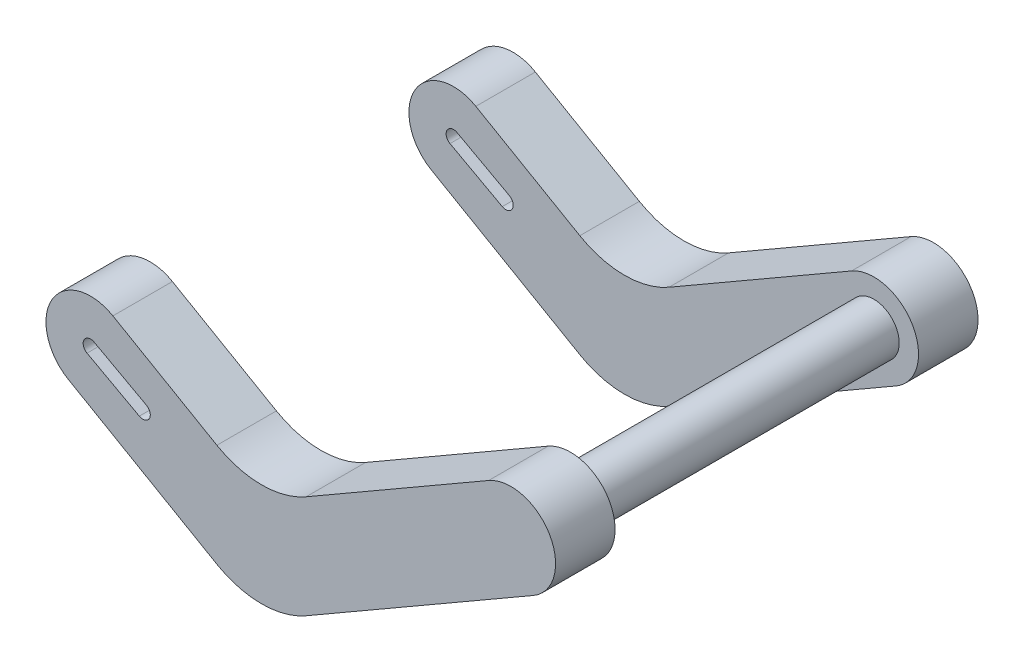
ISO-10303-21;
HEADER;
FILE_DESCRIPTION(('STEP AP214'),'2;1');
FILE_NAME('part.step','',(''),(''),'','','');
FILE_SCHEMA(('AUTOMOTIVE_DESIGN { 1 0 10303 214 1 1 1 1 }'));
ENDSEC;
DATA;
#1=APPLICATION_CONTEXT('core data for automotive mechanical design processes');
#2=APPLICATION_PROTOCOL_DEFINITION('international standard','automotive_design',2000,#1);
#3=PRODUCT_CONTEXT('',#1,'mechanical');
#4=PRODUCT('Part','Part','',(#3));
#5=PRODUCT_RELATED_PRODUCT_CATEGORY('part','',(#4));
#6=PRODUCT_DEFINITION_FORMATION('','',#4);
#7=PRODUCT_DEFINITION_CONTEXT('part definition',#1,'design');
#8=PRODUCT_DEFINITION('design','',#6,#7);
#9=PRODUCT_DEFINITION_SHAPE('','',#8);
#10=(LENGTH_UNIT() NAMED_UNIT(*) SI_UNIT(.MILLI.,.METRE.));
#11=(NAMED_UNIT(*) PLANE_ANGLE_UNIT() SI_UNIT($,.RADIAN.));
#12=(NAMED_UNIT(*) SI_UNIT($,.STERADIAN.) SOLID_ANGLE_UNIT());
#13=UNCERTAINTY_MEASURE_WITH_UNIT(LENGTH_MEASURE(1.E-05),#10,'distance_accuracy_value','');
#14=(GEOMETRIC_REPRESENTATION_CONTEXT(3) GLOBAL_UNCERTAINTY_ASSIGNED_CONTEXT((#13)) GLOBAL_UNIT_ASSIGNED_CONTEXT((#10,
#11,#12)) REPRESENTATION_CONTEXT('',''));
#15=CARTESIAN_POINT('',(0.,0.,0.));
#16=DIRECTION('',(0.,0.,1.));
#17=DIRECTION('',(1.,0.,0.));
#18=AXIS2_PLACEMENT_3D('',#15,#16,#17);
#19=CARTESIAN_POINT('',(-7.76,4.22163913732359,2.));
#20=DIRECTION('',(0.,0.,1.));
#21=DIRECTION('',(1.,0.,0.));
#22=AXIS2_PLACEMENT_3D('',#19,#20,#21);
#23=PLANE('',#22);
#24=CARTESIAN_POINT('',(6.37,5.74546309417289,2.));
#25=DIRECTION('',(0.,0.,1.));
#26=DIRECTION('',(1.,0.,0.));
#27=AXIS2_PLACEMENT_3D('',#24,#25,#26);
#28=CIRCLE('',#27,0.85);
#29=CARTESIAN_POINT('',(7.22,5.74546309417289,2.));
#30=VERTEX_POINT('',#29);
#31=EDGE_CURVE('E289',#30,#30,#28,.T.);
#32=ORIENTED_EDGE('',*,*,#31,.F.);
#33=EDGE_LOOP('',(#32));
#34=FACE_BOUND('',#33,.T.);
#35=CARTESIAN_POINT('',(-7.76,4.22163913732359,2.));
#36=DIRECTION('',(0.,0.,1.));
#37=DIRECTION('',(1.,0.,0.));
#38=AXIS2_PLACEMENT_3D('',#35,#36,#37);
#39=CIRCLE('',#38,1.5);
#40=CARTESIAN_POINT('',(-7.01,5.52067724300025,2.));
#41=VERTEX_POINT('',#40);
#42=CARTESIAN_POINT('',(-8.51,2.92260103164694,2.));
#43=VERTEX_POINT('',#42);
#44=EDGE_CURVE('E327',#41,#43,#39,.T.);
#45=ORIENTED_EDGE('',*,*,#44,.T.);
#46=DIRECTION('',(0.866025403784438,-0.500000000000001,0.));
#47=VECTOR('',#46,1.);
#48=CARTESIAN_POINT('',(-8.51,2.92260103164694,2.));
#49=LINE('',#48,#47);
#50=CARTESIAN_POINT('',(-3.51467025752682,0.0385460601390894,2.));
#51=VERTEX_POINT('',#50);
#52=EDGE_CURVE('E330',#43,#51,#49,.T.);
#53=ORIENTED_EDGE('',*,*,#52,.T.);
#54=CARTESIAN_POINT('',(-2.01467025752681,2.6366222714924,2.));
#55=DIRECTION('',(0.,0.,1.));
#56=DIRECTION('',(1.,0.,0.));
#57=AXIS2_PLACEMENT_3D('',#54,#55,#56);
#58=CIRCLE('',#57,3.);
#59=CARTESIAN_POINT('',(-0.514670257526808,0.038546060139089,2.));
#60=VERTEX_POINT('',#59);
#61=EDGE_CURVE('E333',#51,#60,#58,.T.);
#62=ORIENTED_EDGE('',*,*,#61,.T.);
#63=DIRECTION('',(0.866025403784437,0.500000000000002,0.));
#64=VECTOR('',#63,1.);
#65=CARTESIAN_POINT('',(-0.514670257526808,0.038546060139089,2.));
#66=LINE('',#65,#64);
#67=CARTESIAN_POINT('',(7.12000000000001,4.44642498849624,2.));
#68=VERTEX_POINT('',#67);
#69=EDGE_CURVE('E335',#60,#68,#66,.T.);
#70=ORIENTED_EDGE('',*,*,#69,.T.);
#71=CARTESIAN_POINT('',(6.37,5.74546309417289,2.));
#72=DIRECTION('',(0.,0.,1.));
#73=DIRECTION('',(-1.,0.,0.));
#74=AXIS2_PLACEMENT_3D('',#71,#72,#73);
#75=CIRCLE('',#74,1.5);
#76=CARTESIAN_POINT('',(5.62,7.04450119984956,2.));
#77=VERTEX_POINT('',#76);
#78=EDGE_CURVE('E337',#68,#77,#75,.T.);
#79=ORIENTED_EDGE('',*,*,#78,.T.);
#80=DIRECTION('',(-0.866025403784437,-0.500000000000002,0.));
#81=VECTOR('',#80,1.);
#82=CARTESIAN_POINT('',(-2.01467025752681,2.63662227149241,2.));
#83=LINE('',#82,#81);
#84=CARTESIAN_POINT('',(-0.514670257526805,3.50264767527685,2.));
#85=VERTEX_POINT('',#84);
#86=EDGE_CURVE('E339',#77,#85,#83,.T.);
#87=ORIENTED_EDGE('',*,*,#86,.T.);
#88=CARTESIAN_POINT('',(-2.01467025752681,6.10072388663016,2.));
#89=DIRECTION('',(0.,0.,1.));
#90=DIRECTION('',(1.,0.,0.));
#91=AXIS2_PLACEMENT_3D('',#88,#89,#90);
#92=CIRCLE('',#91,3.);
#93=CARTESIAN_POINT('',(-3.51467025752682,3.50264767527685,2.));
#94=VERTEX_POINT('',#93);
#95=EDGE_CURVE('E11',#85,#94,#92,.F.);
#96=ORIENTED_EDGE('',*,*,#95,.T.);
#97=DIRECTION('',(-0.866025403784438,0.500000000000001,0.));
#98=VECTOR('',#97,1.);
#99=CARTESIAN_POINT('',(-7.01,5.52067724300025,2.));
#100=LINE('',#99,#98);
#101=EDGE_CURVE('E341',#94,#41,#100,.T.);
#102=ORIENTED_EDGE('',*,*,#101,.T.);
#103=EDGE_LOOP('',(#45,#53,#62,#70,#79,#87,#96,#102));
#104=FACE_BOUND('',#103,.T.);
#105=DIRECTION('',(0.8784226883503,-0.477884484568636,0.));
#106=VECTOR('',#105,1.);
#107=CARTESIAN_POINT('',(-7.87947112114216,4.00203346523601,2.));
#108=LINE('',#107,#106);
#109=CARTESIAN_POINT('',(-7.87947112114216,4.00203346523601,2.));
#110=VERTEX_POINT('',#109);
#111=CARTESIAN_POINT('',(-6.12262574444156,3.04626449609873,2.));
#112=VERTEX_POINT('',#111);
#113=EDGE_CURVE('E298',#110,#112,#108,.T.);
#114=ORIENTED_EDGE('',*,*,#113,.F.);
#115=CARTESIAN_POINT('',(-7.76,4.22163913732359,2.));
#116=DIRECTION('',(0.,0.,1.));
#117=DIRECTION('',(1.,0.,0.));
#118=AXIS2_PLACEMENT_3D('',#115,#116,#117);
#119=CIRCLE('',#118,0.250000000000001);
#120=CARTESIAN_POINT('',(-7.64052887885784,4.44124480941116,2.));
#121=VERTEX_POINT('',#120);
#122=EDGE_CURVE('E296',#121,#110,#119,.T.);
#123=ORIENTED_EDGE('',*,*,#122,.F.);
#124=DIRECTION('',(-0.8784226883503,0.477884484568638,0.));
#125=VECTOR('',#124,1.);
#126=CARTESIAN_POINT('',(-7.64052887885784,4.44124480941116,2.));
#127=LINE('',#126,#125);
#128=CARTESIAN_POINT('',(-5.88368350215724,3.48547584027388,2.));
#129=VERTEX_POINT('',#128);
#130=EDGE_CURVE('E304',#129,#121,#127,.T.);
#131=ORIENTED_EDGE('',*,*,#130,.F.);
#132=CARTESIAN_POINT('',(-6.0031546232994,3.26587016818631,2.));
#133=DIRECTION('',(0.,0.,1.));
#134=DIRECTION('',(1.,0.,0.));
#135=AXIS2_PLACEMENT_3D('',#132,#133,#134);
#136=CIRCLE('',#135,0.25);
#137=EDGE_CURVE('E301',#112,#129,#136,.T.);
#138=ORIENTED_EDGE('',*,*,#137,.F.);
#139=EDGE_LOOP('',(#114,#123,#131,#138));
#140=FACE_BOUND('',#139,.T.);
#141=ADVANCED_FACE('F33',(#34,#104,#140),#23,.T.);
#142=CARTESIAN_POINT('',(-7.76,4.22163913732359,0.));
#143=DIRECTION('',(0.,0.,1.));
#144=DIRECTION('',(1.,0.,0.));
#145=AXIS2_PLACEMENT_3D('',#142,#143,#144);
#146=PLANE('',#145);
#147=CARTESIAN_POINT('',(-7.76,4.22163913732359,0.));
#148=DIRECTION('',(0.,0.,1.));
#149=DIRECTION('',(1.,0.,0.));
#150=AXIS2_PLACEMENT_3D('',#147,#148,#149);
#151=CIRCLE('',#150,1.5);
#152=CARTESIAN_POINT('',(-7.01,5.52067724300025,0.));
#153=VERTEX_POINT('',#152);
#154=CARTESIAN_POINT('',(-8.51,2.92260103164694,0.));
#155=VERTEX_POINT('',#154);
#156=EDGE_CURVE('E326',#153,#155,#151,.T.);
#157=ORIENTED_EDGE('',*,*,#156,.F.);
#158=DIRECTION('',(-0.866025403784438,0.500000000000001,0.));
#159=VECTOR('',#158,1.);
#160=CARTESIAN_POINT('',(-7.01,5.52067724300025,0.));
#161=LINE('',#160,#159);
#162=CARTESIAN_POINT('',(-3.51467025752682,3.50264767527685,0.));
#163=VERTEX_POINT('',#162);
#164=EDGE_CURVE('E331',#163,#153,#161,.T.);
#165=ORIENTED_EDGE('',*,*,#164,.F.);
#166=CARTESIAN_POINT('',(-2.01467025752681,6.10072388663016,0.));
#167=DIRECTION('',(0.,0.,1.));
#168=DIRECTION('',(1.,0.,0.));
#169=AXIS2_PLACEMENT_3D('',#166,#167,#168);
#170=CIRCLE('',#169,3.);
#171=CARTESIAN_POINT('',(-0.514670257526805,3.50264767527685,0.));
#172=VERTEX_POINT('',#171);
#173=EDGE_CURVE('E41',#163,#172,#170,.T.);
#174=ORIENTED_EDGE('',*,*,#173,.T.);
#175=DIRECTION('',(-0.866025403784437,-0.500000000000002,0.));
#176=VECTOR('',#175,1.);
#177=CARTESIAN_POINT('',(-2.01467025752681,2.63662227149241,0.));
#178=LINE('',#177,#176);
#179=CARTESIAN_POINT('',(5.62,7.04450119984956,0.));
#180=VERTEX_POINT('',#179);
#181=EDGE_CURVE('E354',#180,#172,#178,.T.);
#182=ORIENTED_EDGE('',*,*,#181,.F.);
#183=CARTESIAN_POINT('',(6.37,5.74546309417289,0.));
#184=DIRECTION('',(0.,0.,1.));
#185=DIRECTION('',(-1.,0.,0.));
#186=AXIS2_PLACEMENT_3D('',#183,#184,#185);
#187=CIRCLE('',#186,1.5);
#188=CARTESIAN_POINT('',(7.12000000000001,4.44642498849624,0.));
#189=VERTEX_POINT('',#188);
#190=EDGE_CURVE('E352',#189,#180,#187,.T.);
#191=ORIENTED_EDGE('',*,*,#190,.F.);
#192=DIRECTION('',(0.866025403784437,0.500000000000002,0.));
#193=VECTOR('',#192,1.);
#194=CARTESIAN_POINT('',(-0.514670257526808,0.038546060139089,0.));
#195=LINE('',#194,#193);
#196=CARTESIAN_POINT('',(-0.514670257526808,0.038546060139089,0.));
#197=VERTEX_POINT('',#196);
#198=EDGE_CURVE('E350',#197,#189,#195,.T.);
#199=ORIENTED_EDGE('',*,*,#198,.F.);
#200=CARTESIAN_POINT('',(-2.01467025752681,2.6366222714924,0.));
#201=DIRECTION('',(0.,0.,1.));
#202=DIRECTION('',(1.,0.,0.));
#203=AXIS2_PLACEMENT_3D('',#200,#201,#202);
#204=CIRCLE('',#203,3.);
#205=CARTESIAN_POINT('',(-3.51467025752682,0.0385460601390894,0.));
#206=VERTEX_POINT('',#205);
#207=EDGE_CURVE('E348',#206,#197,#204,.T.);
#208=ORIENTED_EDGE('',*,*,#207,.F.);
#209=DIRECTION('',(0.866025403784438,-0.500000000000001,0.));
#210=VECTOR('',#209,1.);
#211=CARTESIAN_POINT('',(-8.51,2.92260103164694,0.));
#212=LINE('',#211,#210);
#213=EDGE_CURVE('E346',#155,#206,#212,.T.);
#214=ORIENTED_EDGE('',*,*,#213,.F.);
#215=EDGE_LOOP('',(#157,#165,#174,#182,#191,#199,#208,#214));
#216=FACE_BOUND('',#215,.T.);
#217=CARTESIAN_POINT('',(-7.76,4.22163913732359,0.));
#218=DIRECTION('',(0.,0.,1.));
#219=DIRECTION('',(1.,0.,0.));
#220=AXIS2_PLACEMENT_3D('',#217,#218,#219);
#221=CIRCLE('',#220,0.250000000000001);
#222=CARTESIAN_POINT('',(-7.64052887885784,4.44124480941116,0.));
#223=VERTEX_POINT('',#222);
#224=CARTESIAN_POINT('',(-7.87947112114216,4.00203346523601,0.));
#225=VERTEX_POINT('',#224);
#226=EDGE_CURVE('E293',#223,#225,#221,.T.);
#227=ORIENTED_EDGE('',*,*,#226,.T.);
#228=DIRECTION('',(0.8784226883503,-0.477884484568636,0.));
#229=VECTOR('',#228,1.);
#230=CARTESIAN_POINT('',(-7.87947112114216,4.00203346523601,0.));
#231=LINE('',#230,#229);
#232=CARTESIAN_POINT('',(-6.12262574444156,3.04626449609873,0.));
#233=VERTEX_POINT('',#232);
#234=EDGE_CURVE('E309',#225,#233,#231,.T.);
#235=ORIENTED_EDGE('',*,*,#234,.T.);
#236=CARTESIAN_POINT('',(-6.0031546232994,3.26587016818631,0.));
#237=DIRECTION('',(0.,0.,1.));
#238=DIRECTION('',(1.,0.,0.));
#239=AXIS2_PLACEMENT_3D('',#236,#237,#238);
#240=CIRCLE('',#239,0.25);
#241=CARTESIAN_POINT('',(-5.88368350215724,3.48547584027388,0.));
#242=VERTEX_POINT('',#241);
#243=EDGE_CURVE('E312',#233,#242,#240,.T.);
#244=ORIENTED_EDGE('',*,*,#243,.T.);
#245=DIRECTION('',(-0.8784226883503,0.477884484568638,0.));
#246=VECTOR('',#245,1.);
#247=CARTESIAN_POINT('',(-7.64052887885784,4.44124480941116,0.));
#248=LINE('',#247,#246);
#249=EDGE_CURVE('E299',#242,#223,#248,.T.);
#250=ORIENTED_EDGE('',*,*,#249,.T.);
#251=EDGE_LOOP('',(#227,#235,#244,#250));
#252=FACE_BOUND('',#251,.T.);
#253=ADVANCED_FACE('F431',(#216,#252),#146,.F.);
#254=CARTESIAN_POINT('',(-7.76,4.22163913732359,2.));
#255=DIRECTION('',(0.,0.,-1.));
#256=DIRECTION('',(-1.,0.,0.));
#257=AXIS2_PLACEMENT_3D('',#254,#255,#256);
#258=CYLINDRICAL_SURFACE('',#257,1.5);
#259=ORIENTED_EDGE('',*,*,#156,.T.);
#260=DIRECTION('',(0.,0.,-1.));
#261=VECTOR('',#260,1.);
#262=CARTESIAN_POINT('',(-8.51,2.92260103164694,2.));
#263=LINE('',#262,#261);
#264=EDGE_CURVE('E371',#43,#155,#263,.T.);
#265=ORIENTED_EDGE('',*,*,#264,.F.);
#266=ORIENTED_EDGE('',*,*,#44,.F.);
#267=DIRECTION('',(0.,0.,-1.));
#268=VECTOR('',#267,1.);
#269=CARTESIAN_POINT('',(-7.01,5.52067724300025,2.));
#270=LINE('',#269,#268);
#271=EDGE_CURVE('E343',#41,#153,#270,.T.);
#272=ORIENTED_EDGE('',*,*,#271,.T.);
#273=EDGE_LOOP('',(#259,#265,#266,#272));
#274=FACE_BOUND('',#273,.T.);
#275=ADVANCED_FACE('F437',(#274),#258,.T.);
#276=CARTESIAN_POINT('',(-8.51,2.92260103164694,2.));
#277=DIRECTION('',(0.500000000000001,0.866025403784438,0.));
#278=DIRECTION('',(-0.866025403784438,0.500000000000001,0.));
#279=AXIS2_PLACEMENT_3D('',#276,#277,#278);
#280=PLANE('',#279);
#281=ORIENTED_EDGE('',*,*,#213,.T.);
#282=DIRECTION('',(0.,0.,-1.));
#283=VECTOR('',#282,1.);
#284=CARTESIAN_POINT('',(-3.51467025752682,0.0385460601390894,2.));
#285=LINE('',#284,#283);
#286=EDGE_CURVE('E368',#51,#206,#285,.T.);
#287=ORIENTED_EDGE('',*,*,#286,.F.);
#288=ORIENTED_EDGE('',*,*,#52,.F.);
#289=ORIENTED_EDGE('',*,*,#264,.T.);
#290=EDGE_LOOP('',(#281,#287,#288,#289));
#291=FACE_BOUND('',#290,.T.);
#292=ADVANCED_FACE('F463',(#291),#280,.F.);
#293=CARTESIAN_POINT('',(-2.01467025752681,2.6366222714924,2.));
#294=DIRECTION('',(0.,0.,-1.));
#295=DIRECTION('',(-1.,0.,0.));
#296=AXIS2_PLACEMENT_3D('',#293,#294,#295);
#297=CYLINDRICAL_SURFACE('',#296,3.);
#298=ORIENTED_EDGE('',*,*,#207,.T.);
#299=DIRECTION('',(0.,0.,-1.));
#300=VECTOR('',#299,1.);
#301=CARTESIAN_POINT('',(-0.514670257526808,0.038546060139089,2.));
#302=LINE('',#301,#300);
#303=EDGE_CURVE('E365',#60,#197,#302,.T.);
#304=ORIENTED_EDGE('',*,*,#303,.F.);
#305=ORIENTED_EDGE('',*,*,#61,.F.);
#306=ORIENTED_EDGE('',*,*,#286,.T.);
#307=EDGE_LOOP('',(#298,#304,#305,#306));
#308=FACE_BOUND('',#307,.T.);
#309=ADVANCED_FACE('F459',(#308),#297,.T.);
#310=CARTESIAN_POINT('',(-0.514670257526808,0.038546060139089,2.));
#311=DIRECTION('',(-0.500000000000003,0.866025403784437,0.));
#312=DIRECTION('',(-0.866025403784437,-0.500000000000003,0.));
#313=AXIS2_PLACEMENT_3D('',#310,#311,#312);
#314=PLANE('',#313);
#315=ORIENTED_EDGE('',*,*,#198,.T.);
#316=DIRECTION('',(0.,0.,-1.));
#317=VECTOR('',#316,1.);
#318=CARTESIAN_POINT('',(7.12000000000001,4.44642498849624,2.));
#319=LINE('',#318,#317);
#320=EDGE_CURVE('E362',#68,#189,#319,.T.);
#321=ORIENTED_EDGE('',*,*,#320,.F.);
#322=ORIENTED_EDGE('',*,*,#69,.F.);
#323=ORIENTED_EDGE('',*,*,#303,.T.);
#324=EDGE_LOOP('',(#315,#321,#322,#323));
#325=FACE_BOUND('',#324,.T.);
#326=ADVANCED_FACE('F455',(#325),#314,.F.);
#327=CARTESIAN_POINT('',(6.37,5.74546309417289,2.));
#328=DIRECTION('',(0.,0.,-1.));
#329=DIRECTION('',(-1.,0.,0.));
#330=AXIS2_PLACEMENT_3D('',#327,#328,#329);
#331=CYLINDRICAL_SURFACE('',#330,1.5);
#332=ORIENTED_EDGE('',*,*,#190,.T.);
#333=DIRECTION('',(0.,0.,-1.));
#334=VECTOR('',#333,1.);
#335=CARTESIAN_POINT('',(5.62,7.04450119984956,2.));
#336=LINE('',#335,#334);
#337=EDGE_CURVE('E359',#77,#180,#336,.T.);
#338=ORIENTED_EDGE('',*,*,#337,.F.);
#339=ORIENTED_EDGE('',*,*,#78,.F.);
#340=ORIENTED_EDGE('',*,*,#320,.T.);
#341=EDGE_LOOP('',(#332,#338,#339,#340));
#342=FACE_BOUND('',#341,.T.);
#343=ADVANCED_FACE('F452',(#342),#331,.T.);
#344=CARTESIAN_POINT('',(-2.01467025752681,2.63662227149241,2.));
#345=DIRECTION('',(0.500000000000002,-0.866025403784437,0.));
#346=DIRECTION('',(0.866025403784437,0.500000000000002,0.));
#347=AXIS2_PLACEMENT_3D('',#344,#345,#346);
#348=PLANE('',#347);
#349=ORIENTED_EDGE('',*,*,#181,.T.);
#350=DIRECTION('',(0.,0.,-1.));
#351=VECTOR('',#350,1.);
#352=CARTESIAN_POINT('',(-0.514670257526805,3.50264767527685,2.));
#353=LINE('',#352,#351);
#354=EDGE_CURVE('E48',#172,#85,#353,.F.);
#355=ORIENTED_EDGE('',*,*,#354,.T.);
#356=ORIENTED_EDGE('',*,*,#86,.F.);
#357=ORIENTED_EDGE('',*,*,#337,.T.);
#358=EDGE_LOOP('',(#349,#355,#356,#357));
#359=FACE_BOUND('',#358,.T.);
#360=ADVANCED_FACE('F448',(#359),#348,.F.);
#361=CARTESIAN_POINT('',(-7.01,5.52067724300025,2.));
#362=DIRECTION('',(-0.500000000000001,-0.866025403784438,0.));
#363=DIRECTION('',(0.866025403784438,-0.500000000000001,0.));
#364=AXIS2_PLACEMENT_3D('',#361,#362,#363);
#365=PLANE('',#364);
#366=ORIENTED_EDGE('',*,*,#101,.F.);
#367=DIRECTION('',(0.,0.,-1.));
#368=VECTOR('',#367,1.);
#369=CARTESIAN_POINT('',(-3.51467025752682,3.50264767527685,0.));
#370=LINE('',#369,#368);
#371=EDGE_CURVE('E379',#94,#163,#370,.T.);
#372=ORIENTED_EDGE('',*,*,#371,.T.);
#373=ORIENTED_EDGE('',*,*,#164,.T.);
#374=ORIENTED_EDGE('',*,*,#271,.F.);
#375=EDGE_LOOP('',(#366,#372,#373,#374));
#376=FACE_BOUND('',#375,.T.);
#377=ADVANCED_FACE('F445',(#376),#365,.F.);
#378=CARTESIAN_POINT('',(-7.76,4.22163913732359,2.));
#379=DIRECTION('',(0.,0.,-1.));
#380=DIRECTION('',(-1.,0.,0.));
#381=AXIS2_PLACEMENT_3D('',#378,#379,#380);
#382=CYLINDRICAL_SURFACE('',#381,0.250000000000001);
#383=ORIENTED_EDGE('',*,*,#226,.F.);
#384=DIRECTION('',(0.,0.,-1.));
#385=VECTOR('',#384,1.);
#386=CARTESIAN_POINT('',(-7.64052887885784,4.44124480941116,2.));
#387=LINE('',#386,#385);
#388=EDGE_CURVE('E306',#121,#223,#387,.T.);
#389=ORIENTED_EDGE('',*,*,#388,.F.);
#390=ORIENTED_EDGE('',*,*,#122,.T.);
#391=DIRECTION('',(0.,0.,-1.));
#392=VECTOR('',#391,1.);
#393=CARTESIAN_POINT('',(-7.87947112114216,4.00203346523601,2.));
#394=LINE('',#393,#392);
#395=EDGE_CURVE('E323',#110,#225,#394,.T.);
#396=ORIENTED_EDGE('',*,*,#395,.T.);
#397=EDGE_LOOP('',(#383,#389,#390,#396));
#398=FACE_BOUND('',#397,.T.);
#399=ADVANCED_FACE('F442',(#398),#382,.F.);
#400=CARTESIAN_POINT('',(-7.87947112114216,4.00203346523601,2.));
#401=DIRECTION('',(0.477884484568636,0.8784226883503,0.));
#402=DIRECTION('',(-0.8784226883503,0.477884484568637,0.));
#403=AXIS2_PLACEMENT_3D('',#400,#401,#402);
#404=PLANE('',#403);
#405=ORIENTED_EDGE('',*,*,#234,.F.);
#406=ORIENTED_EDGE('',*,*,#395,.F.);
#407=ORIENTED_EDGE('',*,*,#113,.T.);
#408=DIRECTION('',(0.,0.,-1.));
#409=VECTOR('',#408,1.);
#410=CARTESIAN_POINT('',(-6.12262574444156,3.04626449609873,2.));
#411=LINE('',#410,#409);
#412=EDGE_CURVE('E321',#112,#233,#411,.T.);
#413=ORIENTED_EDGE('',*,*,#412,.T.);
#414=EDGE_LOOP('',(#405,#406,#407,#413));
#415=FACE_BOUND('',#414,.T.);
#416=ADVANCED_FACE('F638',(#415),#404,.T.);
#417=CARTESIAN_POINT('',(-6.0031546232994,3.26587016818631,2.));
#418=DIRECTION('',(0.,0.,-1.));
#419=DIRECTION('',(-1.,0.,0.));
#420=AXIS2_PLACEMENT_3D('',#417,#418,#419);
#421=CYLINDRICAL_SURFACE('',#420,0.25);
#422=ORIENTED_EDGE('',*,*,#243,.F.);
#423=ORIENTED_EDGE('',*,*,#412,.F.);
#424=ORIENTED_EDGE('',*,*,#137,.T.);
#425=DIRECTION('',(0.,0.,-1.));
#426=VECTOR('',#425,1.);
#427=CARTESIAN_POINT('',(-5.88368350215724,3.48547584027388,2.));
#428=LINE('',#427,#426);
#429=EDGE_CURVE('E319',#129,#242,#428,.T.);
#430=ORIENTED_EDGE('',*,*,#429,.T.);
#431=EDGE_LOOP('',(#422,#423,#424,#430));
#432=FACE_BOUND('',#431,.T.);
#433=ADVANCED_FACE('F628',(#432),#421,.F.);
#434=CARTESIAN_POINT('',(-7.64052887885784,4.44124480941116,2.));
#435=DIRECTION('',(-0.477884484568638,-0.8784226883503,0.));
#436=DIRECTION('',(0.8784226883503,-0.477884484568638,0.));
#437=AXIS2_PLACEMENT_3D('',#434,#435,#436);
#438=PLANE('',#437);
#439=ORIENTED_EDGE('',*,*,#249,.F.);
#440=ORIENTED_EDGE('',*,*,#429,.F.);
#441=ORIENTED_EDGE('',*,*,#130,.T.);
#442=ORIENTED_EDGE('',*,*,#388,.T.);
#443=EDGE_LOOP('',(#439,#440,#441,#442));
#444=FACE_BOUND('',#443,.T.);
#445=ADVANCED_FACE('F618',(#444),#438,.T.);
#446=CARTESIAN_POINT('',(6.37,5.74546309417289,12.2));
#447=DIRECTION('',(0.,0.,-1.));
#448=DIRECTION('',(-1.,0.,0.));
#449=AXIS2_PLACEMENT_3D('',#446,#447,#448);
#450=CYLINDRICAL_SURFACE('',#449,0.85);
#451=CARTESIAN_POINT('',(6.37,5.74546309417289,12.2));
#452=DIRECTION('',(0.,0.,1.));
#453=DIRECTION('',(1.,0.,0.));
#454=AXIS2_PLACEMENT_3D('',#451,#452,#453);
#455=CIRCLE('',#454,0.85);
#456=CARTESIAN_POINT('',(7.22,5.74546309417289,12.2));
#457=VERTEX_POINT('',#456);
#458=EDGE_CURVE('E290',#457,#457,#455,.T.);
#459=ORIENTED_EDGE('',*,*,#458,.F.);
#460=EDGE_LOOP('',(#459));
#461=FACE_BOUND('',#460,.T.);
#462=ORIENTED_EDGE('',*,*,#31,.T.);
#463=EDGE_LOOP('',(#462));
#464=FACE_BOUND('',#463,.T.);
#465=ADVANCED_FACE('F609',(#461,#464),#450,.T.);
#466=CARTESIAN_POINT('',(-7.76,4.22163913732359,12.2));
#467=DIRECTION('',(0.,0.,1.));
#468=DIRECTION('',(1.,0.,0.));
#469=AXIS2_PLACEMENT_3D('',#466,#467,#468);
#470=CYLINDRICAL_SURFACE('',#469,1.5);
#471=CARTESIAN_POINT('',(-7.76,4.22163913732359,14.2));
#472=DIRECTION('',(0.,0.,1.));
#473=DIRECTION('',(1.,0.,0.));
#474=AXIS2_PLACEMENT_3D('',#471,#472,#473);
#475=CIRCLE('',#474,1.5);
#476=CARTESIAN_POINT('',(-7.01,5.52067724300025,14.2));
#477=VERTEX_POINT('',#476);
#478=CARTESIAN_POINT('',(-8.51,2.92260103164694,14.2));
#479=VERTEX_POINT('',#478);
#480=EDGE_CURVE('E204',#477,#479,#475,.T.);
#481=ORIENTED_EDGE('',*,*,#480,.F.);
#482=DIRECTION('',(0.,0.,1.));
#483=VECTOR('',#482,1.);
#484=CARTESIAN_POINT('',(-7.01,5.52067724300025,12.2));
#485=LINE('',#484,#483);
#486=CARTESIAN_POINT('',(-7.01,5.52067724300025,12.2));
#487=VERTEX_POINT('',#486);
#488=EDGE_CURVE('E286',#487,#477,#485,.T.);
#489=ORIENTED_EDGE('',*,*,#488,.F.);
#490=CARTESIAN_POINT('',(-7.76,4.22163913732359,12.2));
#491=DIRECTION('',(0.,0.,1.));
#492=DIRECTION('',(1.,0.,0.));
#493=AXIS2_PLACEMENT_3D('',#490,#491,#492);
#494=CIRCLE('',#493,1.5);
#495=CARTESIAN_POINT('',(-8.51,2.92260103164694,12.2));
#496=VERTEX_POINT('',#495);
#497=EDGE_CURVE('E237',#487,#496,#494,.T.);
#498=ORIENTED_EDGE('',*,*,#497,.T.);
#499=DIRECTION('',(0.,0.,1.));
#500=VECTOR('',#499,1.);
#501=CARTESIAN_POINT('',(-8.51,2.92260103164694,12.2));
#502=LINE('',#501,#500);
#503=EDGE_CURVE('E258',#496,#479,#502,.T.);
#504=ORIENTED_EDGE('',*,*,#503,.T.);
#505=EDGE_LOOP('',(#481,#489,#498,#504));
#506=FACE_BOUND('',#505,.T.);
#507=ADVANCED_FACE('F406',(#506),#470,.T.);
#508=CARTESIAN_POINT('',(-7.01,5.52067724300025,12.2));
#509=DIRECTION('',(0.500000000000001,0.866025403784438,0.));
#510=DIRECTION('',(-0.866025403784438,0.500000000000001,0.));
#511=AXIS2_PLACEMENT_3D('',#508,#509,#510);
#512=PLANE('',#511);
#513=DIRECTION('',(-0.866025403784438,0.500000000000001,0.));
#514=VECTOR('',#513,1.);
#515=CARTESIAN_POINT('',(-7.01,5.52067724300025,14.2));
#516=LINE('',#515,#514);
#517=CARTESIAN_POINT('',(-3.51467025752682,3.50264767527685,14.2));
#518=VERTEX_POINT('',#517);
#519=EDGE_CURVE('E261',#518,#477,#516,.T.);
#520=ORIENTED_EDGE('',*,*,#519,.F.);
#521=DIRECTION('',(0.,0.,1.));
#522=VECTOR('',#521,1.);
#523=CARTESIAN_POINT('',(-3.51467025752682,3.50264767527685,12.2));
#524=LINE('',#523,#522);
#525=CARTESIAN_POINT('',(-3.51467025752682,3.50264767527685,12.2));
#526=VERTEX_POINT('',#525);
#527=EDGE_CURVE('E377',#518,#526,#524,.F.);
#528=ORIENTED_EDGE('',*,*,#527,.T.);
#529=DIRECTION('',(-0.866025403784438,0.500000000000001,0.));
#530=VECTOR('',#529,1.);
#531=CARTESIAN_POINT('',(-7.01,5.52067724300025,12.2));
#532=LINE('',#531,#530);
#533=EDGE_CURVE('E240',#526,#487,#532,.T.);
#534=ORIENTED_EDGE('',*,*,#533,.T.);
#535=ORIENTED_EDGE('',*,*,#488,.T.);
#536=EDGE_LOOP('',(#520,#528,#534,#535));
#537=FACE_BOUND('',#536,.T.);
#538=ADVANCED_FACE('F402',(#537),#512,.T.);
#539=CARTESIAN_POINT('',(-2.01467025752681,2.63662227149241,12.2));
#540=DIRECTION('',(-0.500000000000002,0.866025403784437,0.));
#541=DIRECTION('',(-0.866025403784437,-0.500000000000002,0.));
#542=AXIS2_PLACEMENT_3D('',#539,#540,#541);
#543=PLANE('',#542);
#544=DIRECTION('',(-0.866025403784437,-0.500000000000002,0.));
#545=VECTOR('',#544,1.);
#546=CARTESIAN_POINT('',(-2.01467025752681,2.63662227149241,12.2));
#547=LINE('',#546,#545);
#548=CARTESIAN_POINT('',(5.62,7.04450119984956,12.2));
#549=VERTEX_POINT('',#548);
#550=CARTESIAN_POINT('',(-0.514670257526805,3.50264767527685,12.2));
#551=VERTEX_POINT('',#550);
#552=EDGE_CURVE('E243',#549,#551,#547,.T.);
#553=ORIENTED_EDGE('',*,*,#552,.T.);
#554=DIRECTION('',(0.,0.,1.));
#555=VECTOR('',#554,1.);
#556=CARTESIAN_POINT('',(-0.514670257526805,3.50264767527685,14.2));
#557=LINE('',#556,#555);
#558=CARTESIAN_POINT('',(-0.514670257526805,3.50264767527685,14.2));
#559=VERTEX_POINT('',#558);
#560=EDGE_CURVE('E374',#551,#559,#557,.T.);
#561=ORIENTED_EDGE('',*,*,#560,.T.);
#562=DIRECTION('',(-0.866025403784437,-0.500000000000002,0.));
#563=VECTOR('',#562,1.);
#564=CARTESIAN_POINT('',(-2.01467025752681,2.63662227149241,14.2));
#565=LINE('',#564,#563);
#566=CARTESIAN_POINT('',(5.62,7.04450119984956,14.2));
#567=VERTEX_POINT('',#566);
#568=EDGE_CURVE('E263',#567,#559,#565,.T.);
#569=ORIENTED_EDGE('',*,*,#568,.F.);
#570=DIRECTION('',(0.,0.,1.));
#571=VECTOR('',#570,1.);
#572=CARTESIAN_POINT('',(5.62,7.04450119984956,12.2));
#573=LINE('',#572,#571);
#574=EDGE_CURVE('E284',#549,#567,#573,.T.);
#575=ORIENTED_EDGE('',*,*,#574,.F.);
#576=EDGE_LOOP('',(#553,#561,#569,#575));
#577=FACE_BOUND('',#576,.T.);
#578=ADVANCED_FACE('F395',(#577),#543,.T.);
#579=CARTESIAN_POINT('',(6.37,5.74546309417289,12.2));
#580=DIRECTION('',(0.,0.,1.));
#581=DIRECTION('',(1.,0.,0.));
#582=AXIS2_PLACEMENT_3D('',#579,#580,#581);
#583=CYLINDRICAL_SURFACE('',#582,1.5);
#584=CARTESIAN_POINT('',(6.37,5.74546309417289,14.2));
#585=DIRECTION('',(0.,0.,1.));
#586=DIRECTION('',(-1.,0.,0.));
#587=AXIS2_PLACEMENT_3D('',#584,#585,#586);
#588=CIRCLE('',#587,1.5);
#589=CARTESIAN_POINT('',(7.12000000000001,4.44642498849624,14.2));
#590=VERTEX_POINT('',#589);
#591=EDGE_CURVE('E266',#590,#567,#588,.T.);
#592=ORIENTED_EDGE('',*,*,#591,.F.);
#593=DIRECTION('',(0.,0.,1.));
#594=VECTOR('',#593,1.);
#595=CARTESIAN_POINT('',(7.12000000000001,4.44642498849624,12.2));
#596=LINE('',#595,#594);
#597=CARTESIAN_POINT('',(7.12000000000001,4.44642498849624,12.2));
#598=VERTEX_POINT('',#597);
#599=EDGE_CURVE('E282',#598,#590,#596,.T.);
#600=ORIENTED_EDGE('',*,*,#599,.F.);
#601=CARTESIAN_POINT('',(6.37,5.74546309417289,12.2));
#602=DIRECTION('',(0.,0.,1.));
#603=DIRECTION('',(-1.,0.,0.));
#604=AXIS2_PLACEMENT_3D('',#601,#602,#603);
#605=CIRCLE('',#604,1.5);
#606=EDGE_CURVE('E246',#598,#549,#605,.T.);
#607=ORIENTED_EDGE('',*,*,#606,.T.);
#608=ORIENTED_EDGE('',*,*,#574,.T.);
#609=EDGE_LOOP('',(#592,#600,#607,#608));
#610=FACE_BOUND('',#609,.T.);
#611=ADVANCED_FACE('F421',(#610),#583,.T.);
#612=CARTESIAN_POINT('',(-0.514670257526808,0.038546060139089,12.2));
#613=DIRECTION('',(0.500000000000003,-0.866025403784437,0.));
#614=DIRECTION('',(0.866025403784437,0.500000000000003,0.));
#615=AXIS2_PLACEMENT_3D('',#612,#613,#614);
#616=PLANE('',#615);
#617=DIRECTION('',(0.866025403784437,0.500000000000002,0.));
#618=VECTOR('',#617,1.);
#619=CARTESIAN_POINT('',(-0.514670257526808,0.038546060139089,14.2));
#620=LINE('',#619,#618);
#621=CARTESIAN_POINT('',(-0.514670257526808,0.038546060139089,14.2));
#622=VERTEX_POINT('',#621);
#623=EDGE_CURVE('E269',#622,#590,#620,.T.);
#624=ORIENTED_EDGE('',*,*,#623,.F.);
#625=DIRECTION('',(0.,0.,1.));
#626=VECTOR('',#625,1.);
#627=CARTESIAN_POINT('',(-0.514670257526808,0.038546060139089,12.2));
#628=LINE('',#627,#626);
#629=CARTESIAN_POINT('',(-0.514670257526808,0.038546060139089,12.2));
#630=VERTEX_POINT('',#629);
#631=EDGE_CURVE('E280',#630,#622,#628,.T.);
#632=ORIENTED_EDGE('',*,*,#631,.F.);
#633=DIRECTION('',(0.866025403784437,0.500000000000002,0.));
#634=VECTOR('',#633,1.);
#635=CARTESIAN_POINT('',(-0.514670257526808,0.038546060139089,12.2));
#636=LINE('',#635,#634);
#637=EDGE_CURVE('E249',#630,#598,#636,.T.);
#638=ORIENTED_EDGE('',*,*,#637,.T.);
#639=ORIENTED_EDGE('',*,*,#599,.T.);
#640=EDGE_LOOP('',(#624,#632,#638,#639));
#641=FACE_BOUND('',#640,.T.);
#642=ADVANCED_FACE('F418',(#641),#616,.T.);
#643=CARTESIAN_POINT('',(-2.01467025752681,2.6366222714924,12.2));
#644=DIRECTION('',(0.,0.,1.));
#645=DIRECTION('',(1.,0.,0.));
#646=AXIS2_PLACEMENT_3D('',#643,#644,#645);
#647=CYLINDRICAL_SURFACE('',#646,3.);
#648=CARTESIAN_POINT('',(-2.01467025752681,2.6366222714924,14.2));
#649=DIRECTION('',(0.,0.,1.));
#650=DIRECTION('',(1.,0.,0.));
#651=AXIS2_PLACEMENT_3D('',#648,#649,#650);
#652=CIRCLE('',#651,3.);
#653=CARTESIAN_POINT('',(-3.51467025752682,0.0385460601390894,14.2));
#654=VERTEX_POINT('',#653);
#655=EDGE_CURVE('E272',#654,#622,#652,.T.);
#656=ORIENTED_EDGE('',*,*,#655,.F.);
#657=DIRECTION('',(0.,0.,1.));
#658=VECTOR('',#657,1.);
#659=CARTESIAN_POINT('',(-3.51467025752682,0.0385460601390894,12.2));
#660=LINE('',#659,#658);
#661=CARTESIAN_POINT('',(-3.51467025752682,0.0385460601390894,12.2));
#662=VERTEX_POINT('',#661);
#663=EDGE_CURVE('E278',#662,#654,#660,.T.);
#664=ORIENTED_EDGE('',*,*,#663,.F.);
#665=CARTESIAN_POINT('',(-2.01467025752681,2.6366222714924,12.2));
#666=DIRECTION('',(0.,0.,1.));
#667=DIRECTION('',(1.,0.,0.));
#668=AXIS2_PLACEMENT_3D('',#665,#666,#667);
#669=CIRCLE('',#668,3.);
#670=EDGE_CURVE('E252',#662,#630,#669,.T.);
#671=ORIENTED_EDGE('',*,*,#670,.T.);
#672=ORIENTED_EDGE('',*,*,#631,.T.);
#673=EDGE_LOOP('',(#656,#664,#671,#672));
#674=FACE_BOUND('',#673,.T.);
#675=ADVANCED_FACE('F414',(#674),#647,.T.);
#676=CARTESIAN_POINT('',(-8.51,2.92260103164694,12.2));
#677=DIRECTION('',(-0.500000000000001,-0.866025403784438,0.));
#678=DIRECTION('',(0.866025403784438,-0.500000000000001,0.));
#679=AXIS2_PLACEMENT_3D('',#676,#677,#678);
#680=PLANE('',#679);
#681=DIRECTION('',(0.866025403784438,-0.500000000000001,0.));
#682=VECTOR('',#681,1.);
#683=CARTESIAN_POINT('',(-8.51,2.92260103164694,14.2));
#684=LINE('',#683,#682);
#685=EDGE_CURVE('E241',#479,#654,#684,.T.);
#686=ORIENTED_EDGE('',*,*,#685,.F.);
#687=ORIENTED_EDGE('',*,*,#503,.F.);
#688=DIRECTION('',(0.866025403784438,-0.500000000000001,0.));
#689=VECTOR('',#688,1.);
#690=CARTESIAN_POINT('',(-8.51,2.92260103164694,12.2));
#691=LINE('',#690,#689);
#692=EDGE_CURVE('E255',#496,#662,#691,.T.);
#693=ORIENTED_EDGE('',*,*,#692,.T.);
#694=ORIENTED_EDGE('',*,*,#663,.T.);
#695=EDGE_LOOP('',(#686,#687,#693,#694));
#696=FACE_BOUND('',#695,.T.);
#697=ADVANCED_FACE('F409',(#696),#680,.T.);
#698=CARTESIAN_POINT('',(-7.76,4.22163913732359,12.2));
#699=DIRECTION('',(0.,0.,-1.));
#700=DIRECTION('',(1.,0.,0.));
#701=AXIS2_PLACEMENT_3D('',#698,#699,#700);
#702=PLANE('',#701);
#703=ORIENTED_EDGE('',*,*,#458,.T.);
#704=EDGE_LOOP('',(#703));
#705=FACE_BOUND('',#704,.T.);
#706=CARTESIAN_POINT('',(-7.76,4.22163913732359,12.2));
#707=DIRECTION('',(0.,0.,1.));
#708=DIRECTION('',(1.,0.,0.));
#709=AXIS2_PLACEMENT_3D('',#706,#707,#708);
#710=CIRCLE('',#709,0.250000000000001);
#711=CARTESIAN_POINT('',(-7.64052887885784,4.44124480941116,12.2));
#712=VERTEX_POINT('',#711);
#713=CARTESIAN_POINT('',(-7.87947112114216,4.00203346523601,12.2));
#714=VERTEX_POINT('',#713);
#715=EDGE_CURVE('E208',#712,#714,#710,.T.);
#716=ORIENTED_EDGE('',*,*,#715,.T.);
#717=DIRECTION('',(0.8784226883503,-0.477884484568636,0.));
#718=VECTOR('',#717,1.);
#719=CARTESIAN_POINT('',(-7.87947112114216,4.00203346523601,12.2));
#720=LINE('',#719,#718);
#721=CARTESIAN_POINT('',(-6.12262574444156,3.04626449609873,12.2));
#722=VERTEX_POINT('',#721);
#723=EDGE_CURVE('E221',#714,#722,#720,.T.);
#724=ORIENTED_EDGE('',*,*,#723,.T.);
#725=CARTESIAN_POINT('',(-6.0031546232994,3.26587016818631,12.2));
#726=DIRECTION('',(0.,0.,1.));
#727=DIRECTION('',(1.,0.,0.));
#728=AXIS2_PLACEMENT_3D('',#725,#726,#727);
#729=CIRCLE('',#728,0.25);
#730=CARTESIAN_POINT('',(-5.88368350215724,3.48547584027388,12.2));
#731=VERTEX_POINT('',#730);
#732=EDGE_CURVE('E219',#722,#731,#729,.T.);
#733=ORIENTED_EDGE('',*,*,#732,.T.);
#734=DIRECTION('',(-0.8784226883503,0.477884484568638,0.));
#735=VECTOR('',#734,1.);
#736=CARTESIAN_POINT('',(-7.64052887885784,4.44124480941116,12.2));
#737=LINE('',#736,#735);
#738=EDGE_CURVE('E198',#731,#712,#737,.T.);
#739=ORIENTED_EDGE('',*,*,#738,.T.);
#740=EDGE_LOOP('',(#716,#724,#733,#739));
#741=FACE_BOUND('',#740,.T.);
#742=ORIENTED_EDGE('',*,*,#497,.F.);
#743=ORIENTED_EDGE('',*,*,#533,.F.);
#744=CARTESIAN_POINT('',(-2.01467025752681,6.10072388663016,12.2));
#745=DIRECTION('',(0.,0.,-1.));
#746=DIRECTION('',(-1.,0.,0.));
#747=AXIS2_PLACEMENT_3D('',#744,#745,#746);
#748=CIRCLE('',#747,3.);
#749=EDGE_CURVE('E385',#526,#551,#748,.F.);
#750=ORIENTED_EDGE('',*,*,#749,.T.);
#751=ORIENTED_EDGE('',*,*,#552,.F.);
#752=ORIENTED_EDGE('',*,*,#606,.F.);
#753=ORIENTED_EDGE('',*,*,#637,.F.);
#754=ORIENTED_EDGE('',*,*,#670,.F.);
#755=ORIENTED_EDGE('',*,*,#692,.F.);
#756=EDGE_LOOP('',(#742,#743,#750,#751,#752,#753,#754,#755));
#757=FACE_BOUND('',#756,.T.);
#758=ADVANCED_FACE('F217',(#705,#741,#757),#702,.T.);
#759=CARTESIAN_POINT('',(-7.76,4.22163913732359,14.2));
#760=DIRECTION('',(0.,0.,-1.));
#761=DIRECTION('',(1.,0.,0.));
#762=AXIS2_PLACEMENT_3D('',#759,#760,#761);
#763=PLANE('',#762);
#764=DIRECTION('',(0.8784226883503,-0.477884484568636,0.));
#765=VECTOR('',#764,1.);
#766=CARTESIAN_POINT('',(-7.87947112114216,4.00203346523601,14.2));
#767=LINE('',#766,#765);
#768=CARTESIAN_POINT('',(-7.87947112114216,4.00203346523601,14.2));
#769=VERTEX_POINT('',#768);
#770=CARTESIAN_POINT('',(-6.12262574444156,3.04626449609873,14.2));
#771=VERTEX_POINT('',#770);
#772=EDGE_CURVE('E215',#769,#771,#767,.T.);
#773=ORIENTED_EDGE('',*,*,#772,.F.);
#774=CARTESIAN_POINT('',(-7.76,4.22163913732359,14.2));
#775=DIRECTION('',(0.,0.,1.));
#776=DIRECTION('',(1.,0.,0.));
#777=AXIS2_PLACEMENT_3D('',#774,#775,#776);
#778=CIRCLE('',#777,0.250000000000001);
#779=CARTESIAN_POINT('',(-7.64052887885784,4.44124480941116,14.2));
#780=VERTEX_POINT('',#779);
#781=EDGE_CURVE('E225',#780,#769,#778,.T.);
#782=ORIENTED_EDGE('',*,*,#781,.F.);
#783=DIRECTION('',(-0.8784226883503,0.477884484568638,0.));
#784=VECTOR('',#783,1.);
#785=CARTESIAN_POINT('',(-7.64052887885784,4.44124480941116,14.2));
#786=LINE('',#785,#784);
#787=CARTESIAN_POINT('',(-5.88368350215724,3.48547584027388,14.2));
#788=VERTEX_POINT('',#787);
#789=EDGE_CURVE('E201',#788,#780,#786,.T.);
#790=ORIENTED_EDGE('',*,*,#789,.F.);
#791=CARTESIAN_POINT('',(-6.0031546232994,3.26587016818631,14.2));
#792=DIRECTION('',(0.,0.,1.));
#793=DIRECTION('',(1.,0.,0.));
#794=AXIS2_PLACEMENT_3D('',#791,#792,#793);
#795=CIRCLE('',#794,0.25);
#796=EDGE_CURVE('E228',#771,#788,#795,.T.);
#797=ORIENTED_EDGE('',*,*,#796,.F.);
#798=EDGE_LOOP('',(#773,#782,#790,#797));
#799=FACE_BOUND('',#798,.T.);
#800=ORIENTED_EDGE('',*,*,#480,.T.);
#801=ORIENTED_EDGE('',*,*,#685,.T.);
#802=ORIENTED_EDGE('',*,*,#655,.T.);
#803=ORIENTED_EDGE('',*,*,#623,.T.);
#804=ORIENTED_EDGE('',*,*,#591,.T.);
#805=ORIENTED_EDGE('',*,*,#568,.T.);
#806=CARTESIAN_POINT('',(-2.01467025752681,6.10072388663016,14.2));
#807=DIRECTION('',(0.,0.,-1.));
#808=DIRECTION('',(-1.,0.,0.));
#809=AXIS2_PLACEMENT_3D('',#806,#807,#808);
#810=CIRCLE('',#809,3.);
#811=EDGE_CURVE('E383',#559,#518,#810,.T.);
#812=ORIENTED_EDGE('',*,*,#811,.T.);
#813=ORIENTED_EDGE('',*,*,#519,.T.);
#814=EDGE_LOOP('',(#800,#801,#802,#803,#804,#805,#812,#813));
#815=FACE_BOUND('',#814,.T.);
#816=ADVANCED_FACE('F400',(#799,#815),#763,.F.);
#817=CARTESIAN_POINT('',(-7.76,4.22163913732359,12.2));
#818=DIRECTION('',(0.,0.,1.));
#819=DIRECTION('',(1.,0.,0.));
#820=AXIS2_PLACEMENT_3D('',#817,#818,#819);
#821=CYLINDRICAL_SURFACE('',#820,0.250000000000001);
#822=ORIENTED_EDGE('',*,*,#781,.T.);
#823=DIRECTION('',(0.,0.,1.));
#824=VECTOR('',#823,1.);
#825=CARTESIAN_POINT('',(-7.87947112114216,4.00203346523601,12.2));
#826=LINE('',#825,#824);
#827=EDGE_CURVE('E211',#714,#769,#826,.T.);
#828=ORIENTED_EDGE('',*,*,#827,.F.);
#829=ORIENTED_EDGE('',*,*,#715,.F.);
#830=DIRECTION('',(0.,0.,1.));
#831=VECTOR('',#830,1.);
#832=CARTESIAN_POINT('',(-7.64052887885784,4.44124480941116,12.2));
#833=LINE('',#832,#831);
#834=EDGE_CURVE('E194',#712,#780,#833,.T.);
#835=ORIENTED_EDGE('',*,*,#834,.T.);
#836=EDGE_LOOP('',(#822,#828,#829,#835));
#837=FACE_BOUND('',#836,.T.);
#838=ADVANCED_FACE('F209',(#837),#821,.F.);
#839=CARTESIAN_POINT('',(-7.64052887885784,4.44124480941116,12.2));
#840=DIRECTION('',(0.477884484568638,0.8784226883503,0.));
#841=DIRECTION('',(-0.8784226883503,0.477884484568638,0.));
#842=AXIS2_PLACEMENT_3D('',#839,#840,#841);
#843=PLANE('',#842);
#844=ORIENTED_EDGE('',*,*,#789,.T.);
#845=ORIENTED_EDGE('',*,*,#834,.F.);
#846=ORIENTED_EDGE('',*,*,#738,.F.);
#847=DIRECTION('',(0.,0.,1.));
#848=VECTOR('',#847,1.);
#849=CARTESIAN_POINT('',(-5.88368350215724,3.48547584027388,12.2));
#850=LINE('',#849,#848);
#851=EDGE_CURVE('E205',#731,#788,#850,.T.);
#852=ORIENTED_EDGE('',*,*,#851,.T.);
#853=EDGE_LOOP('',(#844,#845,#846,#852));
#854=FACE_BOUND('',#853,.T.);
#855=ADVANCED_FACE('F196',(#854),#843,.F.);
#856=CARTESIAN_POINT('',(-6.0031546232994,3.26587016818631,12.2));
#857=DIRECTION('',(0.,0.,1.));
#858=DIRECTION('',(1.,0.,0.));
#859=AXIS2_PLACEMENT_3D('',#856,#857,#858);
#860=CYLINDRICAL_SURFACE('',#859,0.25);
#861=ORIENTED_EDGE('',*,*,#796,.T.);
#862=ORIENTED_EDGE('',*,*,#851,.F.);
#863=ORIENTED_EDGE('',*,*,#732,.F.);
#864=DIRECTION('',(0.,0.,1.));
#865=VECTOR('',#864,1.);
#866=CARTESIAN_POINT('',(-6.12262574444156,3.04626449609873,12.2));
#867=LINE('',#866,#865);
#868=EDGE_CURVE('E234',#722,#771,#867,.T.);
#869=ORIENTED_EDGE('',*,*,#868,.T.);
#870=EDGE_LOOP('',(#861,#862,#863,#869));
#871=FACE_BOUND('',#870,.T.);
#872=ADVANCED_FACE('F477',(#871),#860,.F.);
#873=CARTESIAN_POINT('',(-7.87947112114216,4.00203346523601,12.2));
#874=DIRECTION('',(-0.477884484568636,-0.8784226883503,0.));
#875=DIRECTION('',(0.8784226883503,-0.477884484568637,0.));
#876=AXIS2_PLACEMENT_3D('',#873,#874,#875);
#877=PLANE('',#876);
#878=ORIENTED_EDGE('',*,*,#772,.T.);
#879=ORIENTED_EDGE('',*,*,#868,.F.);
#880=ORIENTED_EDGE('',*,*,#723,.F.);
#881=ORIENTED_EDGE('',*,*,#827,.T.);
#882=EDGE_LOOP('',(#878,#879,#880,#881));
#883=FACE_BOUND('',#882,.T.);
#884=ADVANCED_FACE('F471',(#883),#877,.F.);
#885=CARTESIAN_POINT('',(-2.01467025752681,6.10072388663016,12.2));
#886=DIRECTION('',(0.,0.,-1.));
#887=DIRECTION('',(-1.,0.,0.));
#888=AXIS2_PLACEMENT_3D('',#885,#886,#887);
#889=CYLINDRICAL_SURFACE('',#888,3.);
#890=ORIENTED_EDGE('',*,*,#749,.F.);
#891=ORIENTED_EDGE('',*,*,#527,.F.);
#892=ORIENTED_EDGE('',*,*,#811,.F.);
#893=ORIENTED_EDGE('',*,*,#560,.F.);
#894=EDGE_LOOP('',(#890,#891,#892,#893));
#895=FACE_BOUND('',#894,.T.);
#896=ADVANCED_FACE('F397',(#895),#889,.F.);
#897=CARTESIAN_POINT('',(-2.01467025752681,6.10072388663016,2.));
#898=DIRECTION('',(0.,0.,1.));
#899=DIRECTION('',(1.,0.,0.));
#900=AXIS2_PLACEMENT_3D('',#897,#898,#899);
#901=CYLINDRICAL_SURFACE('',#900,3.);
#902=ORIENTED_EDGE('',*,*,#95,.F.);
#903=ORIENTED_EDGE('',*,*,#354,.F.);
#904=ORIENTED_EDGE('',*,*,#173,.F.);
#905=ORIENTED_EDGE('',*,*,#371,.F.);
#906=EDGE_LOOP('',(#902,#903,#904,#905));
#907=FACE_BOUND('',#906,.T.);
#908=ADVANCED_FACE('F35',(#907),#901,.F.);
#909=CLOSED_SHELL('',(#141,#253,#275,#292,#309,#326,#343,#360,#377,#399,#416,#433,#445,#465,
#507,#538,#578,#611,#642,#675,#697,#758,#816,#838,#855,#872,#884,#896,#908));
#910=MANIFOLD_SOLID_BREP('B2',#909);
#911=ADVANCED_BREP_SHAPE_REPRESENTATION('',(#18,#910),#14);
#912=SHAPE_DEFINITION_REPRESENTATION(#9,#911);
ENDSEC;
END-ISO-10303-21;
